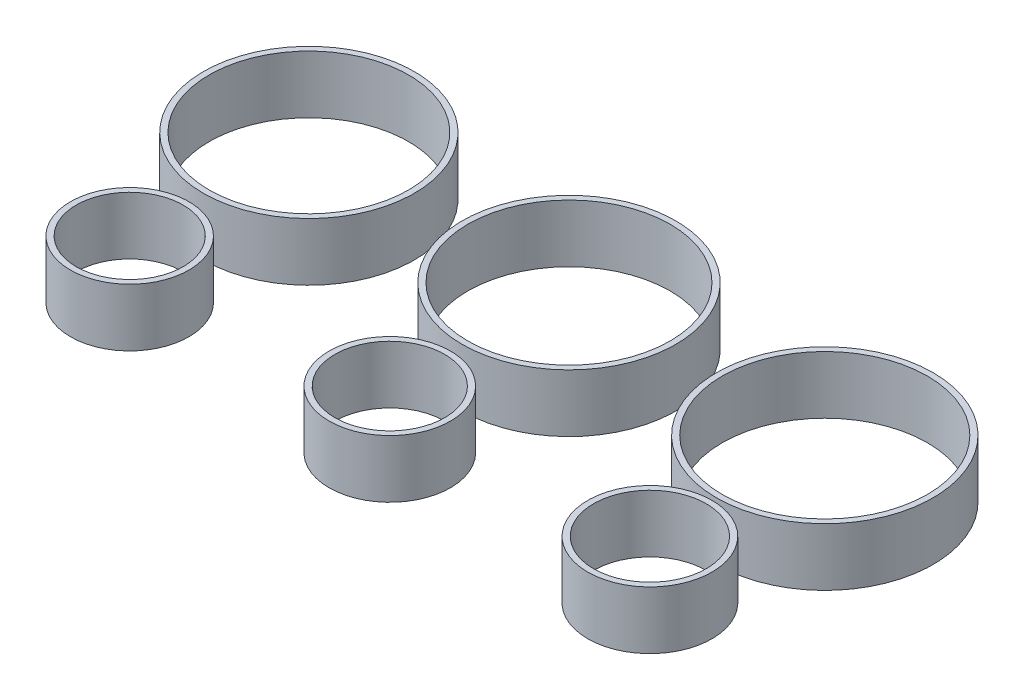
ISO-10303-21;
HEADER;
FILE_DESCRIPTION(('STEP AP214'),'2;1');
FILE_NAME('part.step','',(''),(''),'','','');
FILE_SCHEMA(('AUTOMOTIVE_DESIGN { 1 0 10303 214 1 1 1 1 }'));
ENDSEC;
DATA;
#1=APPLICATION_CONTEXT('core data for automotive mechanical design processes');
#2=APPLICATION_PROTOCOL_DEFINITION('international standard','automotive_design',2000,#1);
#3=PRODUCT_CONTEXT('',#1,'mechanical');
#4=PRODUCT('Part','Part','',(#3));
#5=PRODUCT_RELATED_PRODUCT_CATEGORY('part','',(#4));
#6=PRODUCT_DEFINITION_FORMATION('','',#4);
#7=PRODUCT_DEFINITION_CONTEXT('part definition',#1,'design');
#8=PRODUCT_DEFINITION('design','',#6,#7);
#9=PRODUCT_DEFINITION_SHAPE('','',#8);
#10=(LENGTH_UNIT() NAMED_UNIT(*) SI_UNIT(.MILLI.,.METRE.));
#11=(NAMED_UNIT(*) PLANE_ANGLE_UNIT() SI_UNIT($,.RADIAN.));
#12=(NAMED_UNIT(*) SI_UNIT($,.STERADIAN.) SOLID_ANGLE_UNIT());
#13=UNCERTAINTY_MEASURE_WITH_UNIT(LENGTH_MEASURE(1.E-05),#10,'distance_accuracy_value','');
#14=(GEOMETRIC_REPRESENTATION_CONTEXT(3) GLOBAL_UNCERTAINTY_ASSIGNED_CONTEXT((#13)) GLOBAL_UNIT_ASSIGNED_CONTEXT((#10,
#11,#12)) REPRESENTATION_CONTEXT('',''));
#15=CARTESIAN_POINT('',(0.,0.,0.));
#16=DIRECTION('',(0.,0.,1.));
#17=DIRECTION('',(1.,0.,0.));
#18=AXIS2_PLACEMENT_3D('',#15,#16,#17);
#19=CARTESIAN_POINT('',(90.,10.,31.));
#20=DIRECTION('',(0.,-1.,0.));
#21=DIRECTION('',(0.,0.,-1.));
#22=AXIS2_PLACEMENT_3D('',#19,#20,#21);
#23=CYLINDRICAL_SURFACE('',#22,10.75);
#24=CARTESIAN_POINT('',(90.,10.,31.));
#25=DIRECTION('',(0.,1.,0.));
#26=DIRECTION('',(0.,0.,1.));
#27=AXIS2_PLACEMENT_3D('',#24,#25,#26);
#28=CIRCLE('',#27,10.75);
#29=CARTESIAN_POINT('',(90.,10.,41.75));
#30=VERTEX_POINT('',#29);
#31=EDGE_CURVE('E11',#30,#30,#28,.T.);
#32=ORIENTED_EDGE('',*,*,#31,.F.);
#33=EDGE_LOOP('',(#32));
#34=FACE_BOUND('',#33,.T.);
#35=CARTESIAN_POINT('',(90.,0.,31.));
#36=DIRECTION('',(0.,1.,0.));
#37=DIRECTION('',(0.,0.,1.));
#38=AXIS2_PLACEMENT_3D('',#35,#36,#37);
#39=CIRCLE('',#38,10.75);
#40=CARTESIAN_POINT('',(90.,0.,41.75));
#41=VERTEX_POINT('',#40);
#42=EDGE_CURVE('E43',#41,#41,#39,.T.);
#43=ORIENTED_EDGE('',*,*,#42,.T.);
#44=EDGE_LOOP('',(#43));
#45=FACE_BOUND('',#44,.T.);
#46=ADVANCED_FACE('F40',(#34,#45),#23,.T.);
#47=CARTESIAN_POINT('',(90.,10.,31.));
#48=DIRECTION('',(0.,1.,0.));
#49=DIRECTION('',(0.,0.,1.));
#50=AXIS2_PLACEMENT_3D('',#47,#48,#49);
#51=PLANE('',#50);
#52=CARTESIAN_POINT('',(90.,10.,31.));
#53=DIRECTION('',(0.,1.,0.));
#54=DIRECTION('',(0.,0.,1.));
#55=AXIS2_PLACEMENT_3D('',#52,#53,#54);
#56=CIRCLE('',#55,9.74999999999999);
#57=CARTESIAN_POINT('',(90.,10.,40.75));
#58=VERTEX_POINT('',#57);
#59=EDGE_CURVE('E50',#58,#58,#56,.T.);
#60=ORIENTED_EDGE('',*,*,#59,.F.);
#61=EDGE_LOOP('',(#60));
#62=FACE_BOUND('',#61,.T.);
#63=ORIENTED_EDGE('',*,*,#31,.T.);
#64=EDGE_LOOP('',(#63));
#65=FACE_BOUND('',#64,.T.);
#66=ADVANCED_FACE('F61',(#62,#65),#51,.T.);
#67=CARTESIAN_POINT('',(90.,0.,31.));
#68=DIRECTION('',(0.,1.,0.));
#69=DIRECTION('',(0.,0.,1.));
#70=AXIS2_PLACEMENT_3D('',#67,#68,#69);
#71=PLANE('',#70);
#72=CARTESIAN_POINT('',(90.,0.,31.));
#73=DIRECTION('',(0.,1.,0.));
#74=DIRECTION('',(0.,0.,1.));
#75=AXIS2_PLACEMENT_3D('',#72,#73,#74);
#76=CIRCLE('',#75,9.74999999999999);
#77=CARTESIAN_POINT('',(90.,0.,40.75));
#78=VERTEX_POINT('',#77);
#79=EDGE_CURVE('E52',#78,#78,#76,.T.);
#80=ORIENTED_EDGE('',*,*,#79,.T.);
#81=EDGE_LOOP('',(#80));
#82=FACE_BOUND('',#81,.T.);
#83=ORIENTED_EDGE('',*,*,#42,.F.);
#84=EDGE_LOOP('',(#83));
#85=FACE_BOUND('',#84,.T.);
#86=ADVANCED_FACE('F63',(#82,#85),#71,.F.);
#87=CARTESIAN_POINT('',(90.,10.,31.));
#88=DIRECTION('',(0.,-1.,0.));
#89=DIRECTION('',(0.,0.,-1.));
#90=AXIS2_PLACEMENT_3D('',#87,#88,#89);
#91=CYLINDRICAL_SURFACE('',#90,9.74999999999999);
#92=ORIENTED_EDGE('',*,*,#59,.T.);
#93=EDGE_LOOP('',(#92));
#94=FACE_BOUND('',#93,.T.);
#95=ORIENTED_EDGE('',*,*,#79,.F.);
#96=EDGE_LOOP('',(#95));
#97=FACE_BOUND('',#96,.T.);
#98=ADVANCED_FACE('F58',(#94,#97),#91,.F.);
#99=CLOSED_SHELL('',(#46,#66,#86,#98));
#100=MANIFOLD_SOLID_BREP('B2',#99);
#101=CARTESIAN_POINT('',(45.,10.,31.));
#102=DIRECTION('',(0.,-1.,0.));
#103=DIRECTION('',(0.,0.,-1.));
#104=AXIS2_PLACEMENT_3D('',#101,#102,#103);
#105=CYLINDRICAL_SURFACE('',#104,10.5);
#106=CARTESIAN_POINT('',(45.,10.,31.));
#107=DIRECTION('',(0.,1.,0.));
#108=DIRECTION('',(0.,0.,1.));
#109=AXIS2_PLACEMENT_3D('',#106,#107,#108);
#110=CIRCLE('',#109,10.5);
#111=CARTESIAN_POINT('',(45.,10.,41.5));
#112=VERTEX_POINT('',#111);
#113=EDGE_CURVE('E39',#112,#112,#110,.T.);
#114=ORIENTED_EDGE('',*,*,#113,.F.);
#115=EDGE_LOOP('',(#114));
#116=FACE_BOUND('',#115,.T.);
#117=CARTESIAN_POINT('',(45.,0.,31.));
#118=DIRECTION('',(0.,1.,0.));
#119=DIRECTION('',(0.,0.,1.));
#120=AXIS2_PLACEMENT_3D('',#117,#118,#119);
#121=CIRCLE('',#120,10.5);
#122=CARTESIAN_POINT('',(45.,0.,41.5));
#123=VERTEX_POINT('',#122);
#124=EDGE_CURVE('E113',#123,#123,#121,.T.);
#125=ORIENTED_EDGE('',*,*,#124,.T.);
#126=EDGE_LOOP('',(#125));
#127=FACE_BOUND('',#126,.T.);
#128=ADVANCED_FACE('F110',(#116,#127),#105,.T.);
#129=CARTESIAN_POINT('',(45.,10.,31.));
#130=DIRECTION('',(0.,1.,0.));
#131=DIRECTION('',(0.,0.,1.));
#132=AXIS2_PLACEMENT_3D('',#129,#130,#131);
#133=PLANE('',#132);
#134=CARTESIAN_POINT('',(45.,10.,31.));
#135=DIRECTION('',(0.,1.,0.));
#136=DIRECTION('',(0.,0.,1.));
#137=AXIS2_PLACEMENT_3D('',#134,#135,#136);
#138=CIRCLE('',#137,9.5);
#139=CARTESIAN_POINT('',(45.,10.,40.5));
#140=VERTEX_POINT('',#139);
#141=EDGE_CURVE('E120',#140,#140,#138,.T.);
#142=ORIENTED_EDGE('',*,*,#141,.F.);
#143=EDGE_LOOP('',(#142));
#144=FACE_BOUND('',#143,.T.);
#145=ORIENTED_EDGE('',*,*,#113,.T.);
#146=EDGE_LOOP('',(#145));
#147=FACE_BOUND('',#146,.T.);
#148=ADVANCED_FACE('F131',(#144,#147),#133,.T.);
#149=CARTESIAN_POINT('',(45.,0.,31.));
#150=DIRECTION('',(0.,1.,0.));
#151=DIRECTION('',(0.,0.,1.));
#152=AXIS2_PLACEMENT_3D('',#149,#150,#151);
#153=PLANE('',#152);
#154=CARTESIAN_POINT('',(45.,0.,31.));
#155=DIRECTION('',(0.,1.,0.));
#156=DIRECTION('',(0.,0.,1.));
#157=AXIS2_PLACEMENT_3D('',#154,#155,#156);
#158=CIRCLE('',#157,9.5);
#159=CARTESIAN_POINT('',(45.,0.,40.5));
#160=VERTEX_POINT('',#159);
#161=EDGE_CURVE('E122',#160,#160,#158,.T.);
#162=ORIENTED_EDGE('',*,*,#161,.T.);
#163=EDGE_LOOP('',(#162));
#164=FACE_BOUND('',#163,.T.);
#165=ORIENTED_EDGE('',*,*,#124,.F.);
#166=EDGE_LOOP('',(#165));
#167=FACE_BOUND('',#166,.T.);
#168=ADVANCED_FACE('F133',(#164,#167),#153,.F.);
#169=CARTESIAN_POINT('',(45.,10.,31.));
#170=DIRECTION('',(0.,-1.,0.));
#171=DIRECTION('',(0.,0.,-1.));
#172=AXIS2_PLACEMENT_3D('',#169,#170,#171);
#173=CYLINDRICAL_SURFACE('',#172,9.5);
#174=ORIENTED_EDGE('',*,*,#141,.T.);
#175=EDGE_LOOP('',(#174));
#176=FACE_BOUND('',#175,.T.);
#177=ORIENTED_EDGE('',*,*,#161,.F.);
#178=EDGE_LOOP('',(#177));
#179=FACE_BOUND('',#178,.T.);
#180=ADVANCED_FACE('F128',(#176,#179),#173,.F.);
#181=CLOSED_SHELL('',(#128,#148,#168,#180));
#182=MANIFOLD_SOLID_BREP('B6',#181);
#183=CARTESIAN_POINT('',(0.,10.,31.));
#184=DIRECTION('',(0.,-1.,0.));
#185=DIRECTION('',(0.,0.,-1.));
#186=AXIS2_PLACEMENT_3D('',#183,#184,#185);
#187=CYLINDRICAL_SURFACE('',#186,10.25);
#188=CARTESIAN_POINT('',(0.,10.,31.));
#189=DIRECTION('',(0.,1.,0.));
#190=DIRECTION('',(0.,0.,1.));
#191=AXIS2_PLACEMENT_3D('',#188,#189,#190);
#192=CIRCLE('',#191,10.25);
#193=CARTESIAN_POINT('',(0.,10.,41.25));
#194=VERTEX_POINT('',#193);
#195=EDGE_CURVE('E109',#194,#194,#192,.T.);
#196=ORIENTED_EDGE('',*,*,#195,.F.);
#197=EDGE_LOOP('',(#196));
#198=FACE_BOUND('',#197,.T.);
#199=CARTESIAN_POINT('',(0.,0.,31.));
#200=DIRECTION('',(0.,1.,0.));
#201=DIRECTION('',(0.,0.,1.));
#202=AXIS2_PLACEMENT_3D('',#199,#200,#201);
#203=CIRCLE('',#202,10.25);
#204=CARTESIAN_POINT('',(0.,0.,41.25));
#205=VERTEX_POINT('',#204);
#206=EDGE_CURVE('E183',#205,#205,#203,.T.);
#207=ORIENTED_EDGE('',*,*,#206,.T.);
#208=EDGE_LOOP('',(#207));
#209=FACE_BOUND('',#208,.T.);
#210=ADVANCED_FACE('F180',(#198,#209),#187,.T.);
#211=CARTESIAN_POINT('',(0.,10.,31.));
#212=DIRECTION('',(0.,1.,0.));
#213=DIRECTION('',(0.,0.,1.));
#214=AXIS2_PLACEMENT_3D('',#211,#212,#213);
#215=PLANE('',#214);
#216=CARTESIAN_POINT('',(0.,10.,31.));
#217=DIRECTION('',(0.,1.,0.));
#218=DIRECTION('',(0.,0.,1.));
#219=AXIS2_PLACEMENT_3D('',#216,#217,#218);
#220=CIRCLE('',#219,9.25);
#221=CARTESIAN_POINT('',(0.,10.,40.25));
#222=VERTEX_POINT('',#221);
#223=EDGE_CURVE('E190',#222,#222,#220,.T.);
#224=ORIENTED_EDGE('',*,*,#223,.F.);
#225=EDGE_LOOP('',(#224));
#226=FACE_BOUND('',#225,.T.);
#227=ORIENTED_EDGE('',*,*,#195,.T.);
#228=EDGE_LOOP('',(#227));
#229=FACE_BOUND('',#228,.T.);
#230=ADVANCED_FACE('F201',(#226,#229),#215,.T.);
#231=CARTESIAN_POINT('',(0.,0.,31.));
#232=DIRECTION('',(0.,1.,0.));
#233=DIRECTION('',(0.,0.,1.));
#234=AXIS2_PLACEMENT_3D('',#231,#232,#233);
#235=PLANE('',#234);
#236=CARTESIAN_POINT('',(0.,0.,31.));
#237=DIRECTION('',(0.,1.,0.));
#238=DIRECTION('',(0.,0.,1.));
#239=AXIS2_PLACEMENT_3D('',#236,#237,#238);
#240=CIRCLE('',#239,9.25);
#241=CARTESIAN_POINT('',(0.,0.,40.25));
#242=VERTEX_POINT('',#241);
#243=EDGE_CURVE('E192',#242,#242,#240,.T.);
#244=ORIENTED_EDGE('',*,*,#243,.T.);
#245=EDGE_LOOP('',(#244));
#246=FACE_BOUND('',#245,.T.);
#247=ORIENTED_EDGE('',*,*,#206,.F.);
#248=EDGE_LOOP('',(#247));
#249=FACE_BOUND('',#248,.T.);
#250=ADVANCED_FACE('F203',(#246,#249),#235,.F.);
#251=CARTESIAN_POINT('',(0.,10.,31.));
#252=DIRECTION('',(0.,-1.,0.));
#253=DIRECTION('',(0.,0.,-1.));
#254=AXIS2_PLACEMENT_3D('',#251,#252,#253);
#255=CYLINDRICAL_SURFACE('',#254,9.25);
#256=ORIENTED_EDGE('',*,*,#223,.T.);
#257=EDGE_LOOP('',(#256));
#258=FACE_BOUND('',#257,.T.);
#259=ORIENTED_EDGE('',*,*,#243,.F.);
#260=EDGE_LOOP('',(#259));
#261=FACE_BOUND('',#260,.T.);
#262=ADVANCED_FACE('F198',(#258,#261),#255,.F.);
#263=CLOSED_SHELL('',(#210,#230,#250,#262));
#264=MANIFOLD_SOLID_BREP('B34',#263);
#265=CARTESIAN_POINT('',(90.,10.,0.74047982246582));
#266=DIRECTION('',(0.,-1.,0.));
#267=DIRECTION('',(0.,0.,-1.));
#268=AXIS2_PLACEMENT_3D('',#265,#266,#267);
#269=CYLINDRICAL_SURFACE('',#268,18.75);
#270=CARTESIAN_POINT('',(90.,10.,0.74047982246582));
#271=DIRECTION('',(0.,1.,0.));
#272=DIRECTION('',(0.,0.,1.));
#273=AXIS2_PLACEMENT_3D('',#270,#271,#272);
#274=CIRCLE('',#273,18.75);
#275=CARTESIAN_POINT('',(90.,10.,19.4904798224658));
#276=VERTEX_POINT('',#275);
#277=EDGE_CURVE('E179',#276,#276,#274,.T.);
#278=ORIENTED_EDGE('',*,*,#277,.F.);
#279=EDGE_LOOP('',(#278));
#280=FACE_BOUND('',#279,.T.);
#281=CARTESIAN_POINT('',(90.,0.,0.74047982246582));
#282=DIRECTION('',(0.,1.,0.));
#283=DIRECTION('',(0.,0.,1.));
#284=AXIS2_PLACEMENT_3D('',#281,#282,#283);
#285=CIRCLE('',#284,18.75);
#286=CARTESIAN_POINT('',(90.,0.,19.4904798224658));
#287=VERTEX_POINT('',#286);
#288=EDGE_CURVE('E253',#287,#287,#285,.T.);
#289=ORIENTED_EDGE('',*,*,#288,.T.);
#290=EDGE_LOOP('',(#289));
#291=FACE_BOUND('',#290,.T.);
#292=ADVANCED_FACE('F250',(#280,#291),#269,.T.);
#293=CARTESIAN_POINT('',(90.,10.,0.74047982246582));
#294=DIRECTION('',(0.,1.,0.));
#295=DIRECTION('',(0.,0.,1.));
#296=AXIS2_PLACEMENT_3D('',#293,#294,#295);
#297=PLANE('',#296);
#298=CARTESIAN_POINT('',(90.,10.,0.74047982246582));
#299=DIRECTION('',(0.,-1.,0.));
#300=DIRECTION('',(0.,0.,-1.));
#301=AXIS2_PLACEMENT_3D('',#298,#299,#300);
#302=CIRCLE('',#301,17.75);
#303=CARTESIAN_POINT('',(90.,10.,-17.0095201775342));
#304=VERTEX_POINT('',#303);
#305=EDGE_CURVE('E260',#304,#304,#302,.T.);
#306=ORIENTED_EDGE('',*,*,#305,.T.);
#307=EDGE_LOOP('',(#306));
#308=FACE_BOUND('',#307,.T.);
#309=ORIENTED_EDGE('',*,*,#277,.T.);
#310=EDGE_LOOP('',(#309));
#311=FACE_BOUND('',#310,.T.);
#312=ADVANCED_FACE('F268',(#308,#311),#297,.T.);
#313=CARTESIAN_POINT('',(90.,0.,0.74047982246582));
#314=DIRECTION('',(0.,1.,0.));
#315=DIRECTION('',(0.,0.,1.));
#316=AXIS2_PLACEMENT_3D('',#313,#314,#315);
#317=PLANE('',#316);
#318=CARTESIAN_POINT('',(90.,0.,0.74047982246582));
#319=DIRECTION('',(0.,-1.,0.));
#320=DIRECTION('',(0.,0.,-1.));
#321=AXIS2_PLACEMENT_3D('',#318,#319,#320);
#322=CIRCLE('',#321,17.75);
#323=CARTESIAN_POINT('',(90.,0.,-17.0095201775342));
#324=VERTEX_POINT('',#323);
#325=EDGE_CURVE('E262',#324,#324,#322,.T.);
#326=ORIENTED_EDGE('',*,*,#325,.F.);
#327=EDGE_LOOP('',(#326));
#328=FACE_BOUND('',#327,.T.);
#329=ORIENTED_EDGE('',*,*,#288,.F.);
#330=EDGE_LOOP('',(#329));
#331=FACE_BOUND('',#330,.T.);
#332=ADVANCED_FACE('F273',(#328,#331),#317,.F.);
#333=CARTESIAN_POINT('',(90.,10.,0.74047982246582));
#334=DIRECTION('',(0.,-1.,0.));
#335=DIRECTION('',(0.,0.,-1.));
#336=AXIS2_PLACEMENT_3D('',#333,#334,#335);
#337=CYLINDRICAL_SURFACE('',#336,17.75);
#338=ORIENTED_EDGE('',*,*,#305,.F.);
#339=EDGE_LOOP('',(#338));
#340=FACE_BOUND('',#339,.T.);
#341=ORIENTED_EDGE('',*,*,#325,.T.);
#342=EDGE_LOOP('',(#341));
#343=FACE_BOUND('',#342,.T.);
#344=ADVANCED_FACE('F270',(#340,#343),#337,.F.);
#345=CLOSED_SHELL('',(#292,#312,#332,#344));
#346=MANIFOLD_SOLID_BREP('B104',#345);
#347=CARTESIAN_POINT('',(45.,10.,0.));
#348=DIRECTION('',(0.,-1.,0.));
#349=DIRECTION('',(0.,0.,-1.));
#350=AXIS2_PLACEMENT_3D('',#347,#348,#349);
#351=CYLINDRICAL_SURFACE('',#350,18.5);
#352=CARTESIAN_POINT('',(45.,10.,0.));
#353=DIRECTION('',(0.,1.,0.));
#354=DIRECTION('',(0.,0.,1.));
#355=AXIS2_PLACEMENT_3D('',#352,#353,#354);
#356=CIRCLE('',#355,18.5);
#357=CARTESIAN_POINT('',(45.,10.,18.5));
#358=VERTEX_POINT('',#357);
#359=EDGE_CURVE('E249',#358,#358,#356,.T.);
#360=ORIENTED_EDGE('',*,*,#359,.F.);
#361=EDGE_LOOP('',(#360));
#362=FACE_BOUND('',#361,.T.);
#363=CARTESIAN_POINT('',(45.,0.,0.));
#364=DIRECTION('',(0.,1.,0.));
#365=DIRECTION('',(0.,0.,1.));
#366=AXIS2_PLACEMENT_3D('',#363,#364,#365);
#367=CIRCLE('',#366,18.5);
#368=CARTESIAN_POINT('',(45.,0.,18.5));
#369=VERTEX_POINT('',#368);
#370=EDGE_CURVE('E322',#369,#369,#367,.T.);
#371=ORIENTED_EDGE('',*,*,#370,.T.);
#372=EDGE_LOOP('',(#371));
#373=FACE_BOUND('',#372,.T.);
#374=ADVANCED_FACE('F319',(#362,#373),#351,.T.);
#375=CARTESIAN_POINT('',(45.,10.,0.));
#376=DIRECTION('',(0.,1.,0.));
#377=DIRECTION('',(0.,0.,1.));
#378=AXIS2_PLACEMENT_3D('',#375,#376,#377);
#379=PLANE('',#378);
#380=CARTESIAN_POINT('',(45.,10.,0.));
#381=DIRECTION('',(0.,1.,0.));
#382=DIRECTION('',(0.,0.,1.));
#383=AXIS2_PLACEMENT_3D('',#380,#381,#382);
#384=CIRCLE('',#383,17.5);
#385=CARTESIAN_POINT('',(45.,10.,17.5));
#386=VERTEX_POINT('',#385);
#387=EDGE_CURVE('E331',#386,#386,#384,.T.);
#388=ORIENTED_EDGE('',*,*,#387,.F.);
#389=EDGE_LOOP('',(#388));
#390=FACE_BOUND('',#389,.T.);
#391=ORIENTED_EDGE('',*,*,#359,.T.);
#392=EDGE_LOOP('',(#391));
#393=FACE_BOUND('',#392,.T.);
#394=ADVANCED_FACE('F346',(#390,#393),#379,.T.);
#395=CARTESIAN_POINT('',(45.,0.,0.));
#396=DIRECTION('',(0.,1.,0.));
#397=DIRECTION('',(0.,0.,1.));
#398=AXIS2_PLACEMENT_3D('',#395,#396,#397);
#399=PLANE('',#398);
#400=CARTESIAN_POINT('',(45.,0.,0.));
#401=DIRECTION('',(0.,1.,0.));
#402=DIRECTION('',(0.,0.,1.));
#403=AXIS2_PLACEMENT_3D('',#400,#401,#402);
#404=CIRCLE('',#403,17.5);
#405=CARTESIAN_POINT('',(45.,0.,17.5));
#406=VERTEX_POINT('',#405);
#407=EDGE_CURVE('E329',#406,#406,#404,.T.);
#408=ORIENTED_EDGE('',*,*,#407,.T.);
#409=EDGE_LOOP('',(#408));
#410=FACE_BOUND('',#409,.T.);
#411=ORIENTED_EDGE('',*,*,#370,.F.);
#412=EDGE_LOOP('',(#411));
#413=FACE_BOUND('',#412,.T.);
#414=ADVANCED_FACE('F337',(#410,#413),#399,.F.);
#415=CARTESIAN_POINT('',(45.,0.,0.));
#416=DIRECTION('',(0.,1.,0.));
#417=DIRECTION('',(0.,0.,1.));
#418=AXIS2_PLACEMENT_3D('',#415,#416,#417);
#419=CYLINDRICAL_SURFACE('',#418,17.5);
#420=ORIENTED_EDGE('',*,*,#407,.F.);
#421=EDGE_LOOP('',(#420));
#422=FACE_BOUND('',#421,.T.);
#423=ORIENTED_EDGE('',*,*,#387,.T.);
#424=EDGE_LOOP('',(#423));
#425=FACE_BOUND('',#424,.T.);
#426=ADVANCED_FACE('F340',(#422,#425),#419,.F.);
#427=CLOSED_SHELL('',(#374,#394,#414,#426));
#428=MANIFOLD_SOLID_BREP('B174',#427);
#429=CARTESIAN_POINT('',(0.,10.,0.));
#430=DIRECTION('',(0.,-1.,0.));
#431=DIRECTION('',(0.,0.,-1.));
#432=AXIS2_PLACEMENT_3D('',#429,#430,#431);
#433=CYLINDRICAL_SURFACE('',#432,18.25);
#434=CARTESIAN_POINT('',(0.,10.,0.));
#435=DIRECTION('',(0.,1.,0.));
#436=DIRECTION('',(0.,0.,1.));
#437=AXIS2_PLACEMENT_3D('',#434,#435,#436);
#438=CIRCLE('',#437,18.25);
#439=CARTESIAN_POINT('',(0.,10.,18.25));
#440=VERTEX_POINT('',#439);
#441=EDGE_CURVE('E318',#440,#440,#438,.T.);
#442=ORIENTED_EDGE('',*,*,#441,.F.);
#443=EDGE_LOOP('',(#442));
#444=FACE_BOUND('',#443,.T.);
#445=CARTESIAN_POINT('',(0.,0.,0.));
#446=DIRECTION('',(0.,1.,0.));
#447=DIRECTION('',(0.,0.,1.));
#448=AXIS2_PLACEMENT_3D('',#445,#446,#447);
#449=CIRCLE('',#448,18.25);
#450=CARTESIAN_POINT('',(0.,0.,18.25));
#451=VERTEX_POINT('',#450);
#452=EDGE_CURVE('E384',#451,#451,#449,.T.);
#453=ORIENTED_EDGE('',*,*,#452,.T.);
#454=EDGE_LOOP('',(#453));
#455=FACE_BOUND('',#454,.T.);
#456=ADVANCED_FACE('F381',(#444,#455),#433,.T.);
#457=CARTESIAN_POINT('',(0.,10.,0.));
#458=DIRECTION('',(0.,1.,0.));
#459=DIRECTION('',(0.,0.,1.));
#460=AXIS2_PLACEMENT_3D('',#457,#458,#459);
#461=PLANE('',#460);
#462=CARTESIAN_POINT('',(0.,10.,0.));
#463=DIRECTION('',(0.,1.,0.));
#464=DIRECTION('',(0.,0.,1.));
#465=AXIS2_PLACEMENT_3D('',#462,#463,#464);
#466=CIRCLE('',#465,17.25);
#467=CARTESIAN_POINT('',(0.,10.,17.25));
#468=VERTEX_POINT('',#467);
#469=EDGE_CURVE('E393',#468,#468,#466,.T.);
#470=ORIENTED_EDGE('',*,*,#469,.F.);
#471=EDGE_LOOP('',(#470));
#472=FACE_BOUND('',#471,.T.);
#473=ORIENTED_EDGE('',*,*,#441,.T.);
#474=EDGE_LOOP('',(#473));
#475=FACE_BOUND('',#474,.T.);
#476=ADVANCED_FACE('F408',(#472,#475),#461,.T.);
#477=CARTESIAN_POINT('',(0.,0.,0.));
#478=DIRECTION('',(0.,1.,0.));
#479=DIRECTION('',(0.,0.,1.));
#480=AXIS2_PLACEMENT_3D('',#477,#478,#479);
#481=PLANE('',#480);
#482=CARTESIAN_POINT('',(0.,0.,0.));
#483=DIRECTION('',(0.,1.,0.));
#484=DIRECTION('',(0.,0.,1.));
#485=AXIS2_PLACEMENT_3D('',#482,#483,#484);
#486=CIRCLE('',#485,17.25);
#487=CARTESIAN_POINT('',(0.,0.,17.25));
#488=VERTEX_POINT('',#487);
#489=EDGE_CURVE('E391',#488,#488,#486,.T.);
#490=ORIENTED_EDGE('',*,*,#489,.T.);
#491=EDGE_LOOP('',(#490));
#492=FACE_BOUND('',#491,.T.);
#493=ORIENTED_EDGE('',*,*,#452,.F.);
#494=EDGE_LOOP('',(#493));
#495=FACE_BOUND('',#494,.T.);
#496=ADVANCED_FACE('F399',(#492,#495),#481,.F.);
#497=CARTESIAN_POINT('',(0.,0.,0.));
#498=DIRECTION('',(0.,1.,0.));
#499=DIRECTION('',(0.,0.,1.));
#500=AXIS2_PLACEMENT_3D('',#497,#498,#499);
#501=CYLINDRICAL_SURFACE('',#500,17.25);
#502=ORIENTED_EDGE('',*,*,#489,.F.);
#503=EDGE_LOOP('',(#502));
#504=FACE_BOUND('',#503,.T.);
#505=ORIENTED_EDGE('',*,*,#469,.T.);
#506=EDGE_LOOP('',(#505));
#507=FACE_BOUND('',#506,.T.);
#508=ADVANCED_FACE('F402',(#504,#507),#501,.F.);
#509=CLOSED_SHELL('',(#456,#476,#496,#508));
#510=MANIFOLD_SOLID_BREP('B244',#509);
#511=ADVANCED_BREP_SHAPE_REPRESENTATION('',(#18,#100,#182,#264,#346,#428,#510),#14);
#512=SHAPE_DEFINITION_REPRESENTATION(#9,#511);
ENDSEC;
END-ISO-10303-21;
